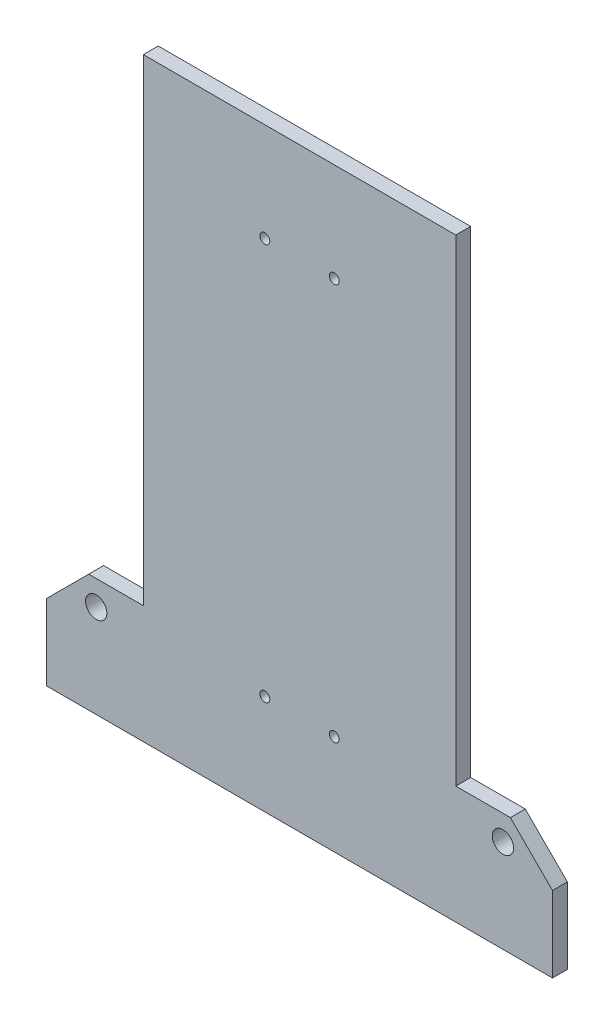
ISO-10303-21;
HEADER;
FILE_DESCRIPTION(('STEP AP214'),'2;1');
FILE_NAME('part.step','',(''),(''),'','','');
FILE_SCHEMA(('AUTOMOTIVE_DESIGN { 1 0 10303 214 1 1 1 1 }'));
ENDSEC;
DATA;
#1=APPLICATION_CONTEXT('core data for automotive mechanical design processes');
#2=APPLICATION_PROTOCOL_DEFINITION('international standard','automotive_design',2000,#1);
#3=PRODUCT_CONTEXT('',#1,'mechanical');
#4=PRODUCT('Part','Part','',(#3));
#5=PRODUCT_RELATED_PRODUCT_CATEGORY('part','',(#4));
#6=PRODUCT_DEFINITION_FORMATION('','',#4);
#7=PRODUCT_DEFINITION_CONTEXT('part definition',#1,'design');
#8=PRODUCT_DEFINITION('design','',#6,#7);
#9=PRODUCT_DEFINITION_SHAPE('','',#8);
#10=(LENGTH_UNIT() NAMED_UNIT(*) SI_UNIT(.MILLI.,.METRE.));
#11=(NAMED_UNIT(*) PLANE_ANGLE_UNIT() SI_UNIT($,.RADIAN.));
#12=(NAMED_UNIT(*) SI_UNIT($,.STERADIAN.) SOLID_ANGLE_UNIT());
#13=UNCERTAINTY_MEASURE_WITH_UNIT(LENGTH_MEASURE(1.E-05),#10,'distance_accuracy_value','');
#14=(GEOMETRIC_REPRESENTATION_CONTEXT(3) GLOBAL_UNCERTAINTY_ASSIGNED_CONTEXT((#13)) GLOBAL_UNIT_ASSIGNED_CONTEXT((#10,
#11,#12)) REPRESENTATION_CONTEXT('',''));
#15=CARTESIAN_POINT('',(0.,0.,0.));
#16=DIRECTION('',(0.,0.,1.));
#17=DIRECTION('',(1.,0.,0.));
#18=AXIS2_PLACEMENT_3D('',#15,#16,#17);
#19=CARTESIAN_POINT('',(-51.0024999998337,41.5460476557996,-3.));
#20=DIRECTION('',(-1.,0.,0.));
#21=DIRECTION('',(0.,0.,1.));
#22=AXIS2_PLACEMENT_3D('',#19,#20,#21);
#23=PLANE('',#22);
#24=DIRECTION('',(0.,0.,1.));
#25=VECTOR('',#24,1.);
#26=CARTESIAN_POINT('',(-51.002499999906,-53.6128200867682,-10.));
#27=LINE('',#26,#25);
#28=CARTESIAN_POINT('',(-51.002499999906,-53.6128200867682,-3.));
#29=VERTEX_POINT('',#28);
#30=CARTESIAN_POINT('',(-51.0024999998337,-53.6128200867682,0.));
#31=VERTEX_POINT('',#30);
#32=EDGE_CURVE('E59',#29,#31,#27,.T.);
#33=ORIENTED_EDGE('',*,*,#32,.F.);
#34=DIRECTION('',(0.,-1.,0.));
#35=VECTOR('',#34,1.);
#36=CARTESIAN_POINT('',(-51.0024999998337,41.5460476557996,-3.));
#37=LINE('',#36,#35);
#38=CARTESIAN_POINT('',(-51.0024999998337,-68.8918828157931,-3.));
#39=VERTEX_POINT('',#38);
#40=EDGE_CURVE('E198',#29,#39,#37,.T.);
#41=ORIENTED_EDGE('',*,*,#40,.T.);
#42=DIRECTION('',(0.,0.,1.));
#43=VECTOR('',#42,1.);
#44=CARTESIAN_POINT('',(-51.0024999998337,-68.8918828157931,-3.));
#45=LINE('',#44,#43);
#46=CARTESIAN_POINT('',(-51.0024999998337,-68.8918828157931,0.));
#47=VERTEX_POINT('',#46);
#48=EDGE_CURVE('E43',#39,#47,#45,.T.);
#49=ORIENTED_EDGE('',*,*,#48,.T.);
#50=DIRECTION('',(0.,-1.,0.));
#51=VECTOR('',#50,1.);
#52=CARTESIAN_POINT('',(-51.0024999998337,41.5460476557996,0.));
#53=LINE('',#52,#51);
#54=EDGE_CURVE('E195',#31,#47,#53,.T.);
#55=ORIENTED_EDGE('',*,*,#54,.F.);
#56=EDGE_LOOP('',(#33,#41,#49,#55));
#57=FACE_BOUND('',#56,.T.);
#58=ADVANCED_FACE('F35',(#57),#23,.T.);
#59=CARTESIAN_POINT('',(40.1096344098316,51.1081171842069,-3.));
#60=DIRECTION('',(0.,1.,0.));
#61=DIRECTION('',(-1.,0.,0.));
#62=AXIS2_PLACEMENT_3D('',#59,#60,#61);
#63=PLANE('',#62);
#64=DIRECTION('',(0.,0.,1.));
#65=VECTOR('',#64,1.);
#66=CARTESIAN_POINT('',(31.4999683606802,51.1081171842069,-3.));
#67=LINE('',#66,#65);
#68=CARTESIAN_POINT('',(31.4999683606802,51.1081171842069,-3.));
#69=VERTEX_POINT('',#68);
#70=CARTESIAN_POINT('',(31.4999683606802,51.1081171842069,0.));
#71=VERTEX_POINT('',#70);
#72=EDGE_CURVE('E51',#69,#71,#67,.T.);
#73=ORIENTED_EDGE('',*,*,#72,.F.);
#74=DIRECTION('',(-1.,0.,0.));
#75=VECTOR('',#74,1.);
#76=CARTESIAN_POINT('',(40.1096344098316,51.1081171842069,-3.));
#77=LINE('',#76,#75);
#78=CARTESIAN_POINT('',(-31.4999670619739,51.1081171842069,-3.));
#79=VERTEX_POINT('',#78);
#80=EDGE_CURVE('E207',#69,#79,#77,.T.);
#81=ORIENTED_EDGE('',*,*,#80,.T.);
#82=DIRECTION('',(0.,0.,-1.));
#83=VECTOR('',#82,1.);
#84=CARTESIAN_POINT('',(-31.4999670619739,51.1081171842069,-3.));
#85=LINE('',#84,#83);
#86=CARTESIAN_POINT('',(-31.4999670619739,51.1081171842069,0.));
#87=VERTEX_POINT('',#86);
#88=EDGE_CURVE('E163',#87,#79,#85,.T.);
#89=ORIENTED_EDGE('',*,*,#88,.F.);
#90=DIRECTION('',(-1.,0.,0.));
#91=VECTOR('',#90,1.);
#92=CARTESIAN_POINT('',(40.1096344098316,51.1081171842069,0.));
#93=LINE('',#92,#91);
#94=EDGE_CURVE('E201',#71,#87,#93,.T.);
#95=ORIENTED_EDGE('',*,*,#94,.F.);
#96=EDGE_LOOP('',(#73,#81,#89,#95));
#97=FACE_BOUND('',#96,.T.);
#98=ADVANCED_FACE('F259',(#97),#63,.T.);
#99=CARTESIAN_POINT('',(51.0025000001551,-68.8918828157931,-3.));
#100=DIRECTION('',(1.,0.,0.));
#101=DIRECTION('',(0.,0.,-1.));
#102=AXIS2_PLACEMENT_3D('',#99,#100,#101);
#103=PLANE('',#102);
#104=DIRECTION('',(0.,0.,1.));
#105=VECTOR('',#104,1.);
#106=CARTESIAN_POINT('',(51.002500000094,-53.6128200867551,-10.));
#107=LINE('',#106,#105);
#108=CARTESIAN_POINT('',(51.002500000094,-53.6128200867551,-3.));
#109=VERTEX_POINT('',#108);
#110=CARTESIAN_POINT('',(51.002500000094,-53.6128200867551,0.));
#111=VERTEX_POINT('',#110);
#112=EDGE_CURVE('E139',#109,#111,#107,.T.);
#113=ORIENTED_EDGE('',*,*,#112,.T.);
#114=DIRECTION('',(0.,1.,0.));
#115=VECTOR('',#114,1.);
#116=CARTESIAN_POINT('',(51.0025000001551,-68.8918828157931,0.));
#117=LINE('',#116,#115);
#118=CARTESIAN_POINT('',(51.0025000001551,-68.8918828157931,0.));
#119=VERTEX_POINT('',#118);
#120=EDGE_CURVE('E214',#119,#111,#117,.T.);
#121=ORIENTED_EDGE('',*,*,#120,.F.);
#122=DIRECTION('',(0.,0.,1.));
#123=VECTOR('',#122,1.);
#124=CARTESIAN_POINT('',(51.0025000001551,-68.8918828157931,-3.));
#125=LINE('',#124,#123);
#126=CARTESIAN_POINT('',(51.0025000001551,-68.8918828157931,-3.));
#127=VERTEX_POINT('',#126);
#128=EDGE_CURVE('E11',#127,#119,#125,.T.);
#129=ORIENTED_EDGE('',*,*,#128,.F.);
#130=DIRECTION('',(0.,1.,0.));
#131=VECTOR('',#130,1.);
#132=CARTESIAN_POINT('',(51.0025000001551,-68.8918828157931,-3.));
#133=LINE('',#132,#131);
#134=EDGE_CURVE('E204',#127,#109,#133,.T.);
#135=ORIENTED_EDGE('',*,*,#134,.T.);
#136=EDGE_LOOP('',(#113,#121,#129,#135));
#137=FACE_BOUND('',#136,.T.);
#138=ADVANCED_FACE('F264',(#137),#103,.T.);
#139=CARTESIAN_POINT('',(-51.0024999998337,-68.8918828157931,-3.));
#140=DIRECTION('',(0.,-1.,0.));
#141=DIRECTION('',(0.,0.,-1.));
#142=AXIS2_PLACEMENT_3D('',#139,#140,#141);
#143=PLANE('',#142);
#144=DIRECTION('',(1.,0.,0.));
#145=VECTOR('',#144,1.);
#146=CARTESIAN_POINT('',(-51.0024999998337,-68.8918828157931,0.));
#147=LINE('',#146,#145);
#148=EDGE_CURVE('E211',#47,#119,#147,.T.);
#149=ORIENTED_EDGE('',*,*,#148,.F.);
#150=ORIENTED_EDGE('',*,*,#48,.F.);
#151=DIRECTION('',(1.,0.,0.));
#152=VECTOR('',#151,1.);
#153=CARTESIAN_POINT('',(-51.0024999998337,-68.8918828157931,-3.));
#154=LINE('',#153,#152);
#155=EDGE_CURVE('E200',#39,#127,#154,.T.);
#156=ORIENTED_EDGE('',*,*,#155,.T.);
#157=ORIENTED_EDGE('',*,*,#128,.T.);
#158=EDGE_LOOP('',(#149,#150,#156,#157));
#159=FACE_BOUND('',#158,.T.);
#160=ADVANCED_FACE('F275',(#159),#143,.T.);
#161=CARTESIAN_POINT('',(0.,0.,-3.));
#162=DIRECTION('',(0.,0.,1.));
#163=DIRECTION('',(1.,0.,0.));
#164=AXIS2_PLACEMENT_3D('',#161,#162,#163);
#165=PLANE('',#164);
#166=CARTESIAN_POINT('',(-6.99983400000011,31.25,-3.));
#167=DIRECTION('',(0.,0.,-1.));
#168=DIRECTION('',(-1.,0.,0.));
#169=AXIS2_PLACEMENT_3D('',#166,#167,#168);
#170=CIRCLE('',#169,0.999999999919336);
#171=CARTESIAN_POINT('',(-7.99983399991945,31.25,-3.));
#172=VERTEX_POINT('',#171);
#173=EDGE_CURVE('E176',#172,#172,#170,.T.);
#174=ORIENTED_EDGE('',*,*,#173,.F.);
#175=EDGE_LOOP('',(#174));
#176=FACE_BOUND('',#175,.T.);
#177=CARTESIAN_POINT('',(7.00016599999989,-48.75,-3.));
#178=DIRECTION('',(0.,0.,-1.));
#179=DIRECTION('',(-1.,0.,0.));
#180=AXIS2_PLACEMENT_3D('',#177,#178,#179);
#181=CIRCLE('',#180,0.999999999926114);
#182=CARTESIAN_POINT('',(6.00016600007378,-48.75,-3.));
#183=VERTEX_POINT('',#182);
#184=EDGE_CURVE('E175',#183,#183,#181,.T.);
#185=ORIENTED_EDGE('',*,*,#184,.F.);
#186=EDGE_LOOP('',(#185));
#187=FACE_BOUND('',#186,.T.);
#188=CARTESIAN_POINT('',(-6.99983400000011,-48.75,-3.));
#189=DIRECTION('',(0.,0.,-1.));
#190=DIRECTION('',(-1.,0.,0.));
#191=AXIS2_PLACEMENT_3D('',#188,#189,#190);
#192=CIRCLE('',#191,0.999999999926497);
#193=CARTESIAN_POINT('',(-7.9998339999266,-48.75,-3.));
#194=VERTEX_POINT('',#193);
#195=EDGE_CURVE('E172',#194,#194,#192,.T.);
#196=ORIENTED_EDGE('',*,*,#195,.F.);
#197=EDGE_LOOP('',(#196));
#198=FACE_BOUND('',#197,.T.);
#199=CARTESIAN_POINT('',(7.00016599999989,31.25,-3.));
#200=DIRECTION('',(0.,0.,-1.));
#201=DIRECTION('',(-1.,0.,0.));
#202=AXIS2_PLACEMENT_3D('',#199,#200,#201);
#203=CIRCLE('',#202,0.999999999918957);
#204=CARTESIAN_POINT('',(6.00016600008093,31.25,-3.));
#205=VERTEX_POINT('',#204);
#206=EDGE_CURVE('E179',#205,#205,#203,.T.);
#207=ORIENTED_EDGE('',*,*,#206,.F.);
#208=EDGE_LOOP('',(#207));
#209=FACE_BOUND('',#208,.T.);
#210=CARTESIAN_POINT('',(-41.0024999998454,-50.1275387124924,-3.));
#211=DIRECTION('',(0.,0.,1.));
#212=DIRECTION('',(1.,0.,0.));
#213=AXIS2_PLACEMENT_3D('',#210,#211,#212);
#214=CIRCLE('',#213,2.14999999982672);
#215=CARTESIAN_POINT('',(-38.8525000000187,-50.1275387124924,-3.));
#216=VERTEX_POINT('',#215);
#217=EDGE_CURVE('E192',#216,#216,#214,.T.);
#218=ORIENTED_EDGE('',*,*,#217,.T.);
#219=EDGE_LOOP('',(#218));
#220=FACE_BOUND('',#219,.T.);
#221=CARTESIAN_POINT('',(41.0025000001546,-50.1275387124819,-3.));
#222=DIRECTION('',(0.,0.,1.));
#223=DIRECTION('',(1.,0.,0.));
#224=AXIS2_PLACEMENT_3D('',#221,#222,#223);
#225=CIRCLE('',#224,2.14999999982705);
#226=CARTESIAN_POINT('',(43.1524999999816,-50.1275387124819,-3.));
#227=VERTEX_POINT('',#226);
#228=EDGE_CURVE('E185',#227,#227,#225,.T.);
#229=ORIENTED_EDGE('',*,*,#228,.T.);
#230=EDGE_LOOP('',(#229));
#231=FACE_BOUND('',#230,.T.);
#232=DIRECTION('',(1.,0.,0.));
#233=VECTOR('',#232,1.);
#234=CARTESIAN_POINT('',(0.,-45.1275387125177,-3.));
#235=LINE('',#234,#233);
#236=CARTESIAN_POINT('',(31.4999964812711,-45.1275387125177,-3.));
#237=VERTEX_POINT('',#236);
#238=CARTESIAN_POINT('',(42.5172186258543,-45.1275387125177,-3.));
#239=VERTEX_POINT('',#238);
#240=EDGE_CURVE('E121',#237,#239,#235,.T.);
#241=ORIENTED_EDGE('',*,*,#240,.T.);
#242=DIRECTION('',(0.70710678118664,-0.707106781186455,0.));
#243=VECTOR('',#242,1.);
#244=CARTESIAN_POINT('',(-1.30516004333727,-1.30516004333761,-3.));
#245=LINE('',#244,#243);
#246=EDGE_CURVE('E169',#239,#109,#245,.T.);
#247=ORIENTED_EDGE('',*,*,#246,.T.);
#248=ORIENTED_EDGE('',*,*,#134,.F.);
#249=ORIENTED_EDGE('',*,*,#155,.F.);
#250=ORIENTED_EDGE('',*,*,#40,.F.);
#251=DIRECTION('',(0.707106781186459,0.707106781186636,0.));
#252=VECTOR('',#251,1.);
#253=CARTESIAN_POINT('',(1.3051600434247,-1.30516004342437,-3.));
#254=LINE('',#253,#252);
#255=CARTESIAN_POINT('',(-42.5172186256685,-45.1275387125286,-3.));
#256=VERTEX_POINT('',#255);
#257=EDGE_CURVE('E142',#29,#256,#254,.T.);
#258=ORIENTED_EDGE('',*,*,#257,.T.);
#259=DIRECTION('',(1.,0.,0.));
#260=VECTOR('',#259,1.);
#261=CARTESIAN_POINT('',(0.,-45.1275387125286,-3.));
#262=LINE('',#261,#260);
#263=CARTESIAN_POINT('',(-31.499999355967,-45.1275387125286,-3.));
#264=VERTEX_POINT('',#263);
#265=EDGE_CURVE('E157',#256,#264,#262,.T.);
#266=ORIENTED_EDGE('',*,*,#265,.T.);
#267=DIRECTION('',(3.35572017078833E-07,0.999999999999944,0.));
#268=VECTOR('',#267,1.);
#269=CARTESIAN_POINT('',(-31.4999842124243,1.05705132401152E-05,-3.));
#270=LINE('',#269,#268);
#271=EDGE_CURVE('E160',#264,#79,#270,.T.);
#272=ORIENTED_EDGE('',*,*,#271,.T.);
#273=ORIENTED_EDGE('',*,*,#80,.F.);
#274=DIRECTION('',(2.9220553042759E-07,-0.999999999999957,0.));
#275=VECTOR('',#274,1.);
#276=CARTESIAN_POINT('',(31.499983294752,9.20446932710362E-06,-3.));
#277=LINE('',#276,#275);
#278=EDGE_CURVE('E165',#69,#237,#277,.T.);
#279=ORIENTED_EDGE('',*,*,#278,.T.);
#280=EDGE_LOOP('',(#241,#247,#248,#249,#250,#258,#266,#272,#273,#279));
#281=FACE_BOUND('',#280,.T.);
#282=ADVANCED_FACE('F235',(#176,#187,#198,#209,#220,#231,#281),#165,.F.);
#283=CARTESIAN_POINT('',(0.,0.,0.));
#284=DIRECTION('',(0.,0.,1.));
#285=DIRECTION('',(1.,0.,0.));
#286=AXIS2_PLACEMENT_3D('',#283,#284,#285);
#287=PLANE('',#286);
#288=DIRECTION('',(0.70710678118664,-0.707106781186455,0.));
#289=VECTOR('',#288,1.);
#290=CARTESIAN_POINT('',(51.002500000094,-53.6128200867551,0.));
#291=LINE('',#290,#289);
#292=CARTESIAN_POINT('',(42.5172186258543,-45.1275387125177,0.));
#293=VERTEX_POINT('',#292);
#294=EDGE_CURVE('E124',#293,#111,#291,.T.);
#295=ORIENTED_EDGE('',*,*,#294,.F.);
#296=DIRECTION('',(1.,0.,0.));
#297=VECTOR('',#296,1.);
#298=CARTESIAN_POINT('',(42.5172186258543,-45.1275387125177,0.));
#299=LINE('',#298,#297);
#300=CARTESIAN_POINT('',(31.4999964812711,-45.1275387125177,0.));
#301=VERTEX_POINT('',#300);
#302=EDGE_CURVE('E118',#301,#293,#299,.T.);
#303=ORIENTED_EDGE('',*,*,#302,.F.);
#304=DIRECTION('',(2.9220553042759E-07,-0.999999999999957,0.));
#305=VECTOR('',#304,1.);
#306=CARTESIAN_POINT('',(31.4999647019776,63.6291073381983,0.));
#307=LINE('',#306,#305);
#308=EDGE_CURVE('E126',#71,#301,#307,.T.);
#309=ORIENTED_EDGE('',*,*,#308,.F.);
#310=ORIENTED_EDGE('',*,*,#94,.T.);
#311=DIRECTION('',(3.35572017078833E-07,0.999999999999944,0.));
#312=VECTOR('',#311,1.);
#313=CARTESIAN_POINT('',(-31.4999657706115,54.9563591499105,0.));
#314=LINE('',#313,#312);
#315=CARTESIAN_POINT('',(-31.499999355967,-45.1275387125286,0.));
#316=VERTEX_POINT('',#315);
#317=EDGE_CURVE('E149',#316,#87,#314,.T.);
#318=ORIENTED_EDGE('',*,*,#317,.F.);
#319=DIRECTION('',(1.,0.,0.));
#320=VECTOR('',#319,1.);
#321=CARTESIAN_POINT('',(-31.499999355967,-45.1275387125286,0.));
#322=LINE('',#321,#320);
#323=CARTESIAN_POINT('',(-42.5172186256685,-45.1275387125286,0.));
#324=VERTEX_POINT('',#323);
#325=EDGE_CURVE('E146',#324,#316,#322,.T.);
#326=ORIENTED_EDGE('',*,*,#325,.F.);
#327=DIRECTION('',(0.707106781186459,0.707106781186636,0.));
#328=VECTOR('',#327,1.);
#329=CARTESIAN_POINT('',(-42.5172186256685,-45.1275387125286,0.));
#330=LINE('',#329,#328);
#331=EDGE_CURVE('E144',#31,#324,#330,.T.);
#332=ORIENTED_EDGE('',*,*,#331,.F.);
#333=ORIENTED_EDGE('',*,*,#54,.T.);
#334=ORIENTED_EDGE('',*,*,#148,.T.);
#335=ORIENTED_EDGE('',*,*,#120,.T.);
#336=EDGE_LOOP('',(#295,#303,#309,#310,#318,#326,#332,#333,#334,#335));
#337=FACE_BOUND('',#336,.T.);
#338=CARTESIAN_POINT('',(-6.99983400000011,31.25,0.));
#339=DIRECTION('',(0.,0.,1.));
#340=DIRECTION('',(1.,0.,0.));
#341=AXIS2_PLACEMENT_3D('',#338,#339,#340);
#342=CIRCLE('',#341,0.999999999919336);
#343=CARTESIAN_POINT('',(-5.99983400008078,31.25,0.));
#344=VERTEX_POINT('',#343);
#345=EDGE_CURVE('E38',#344,#344,#342,.T.);
#346=ORIENTED_EDGE('',*,*,#345,.F.);
#347=EDGE_LOOP('',(#346));
#348=FACE_BOUND('',#347,.T.);
#349=CARTESIAN_POINT('',(7.00016599999989,-48.75,0.));
#350=DIRECTION('',(0.,0.,1.));
#351=DIRECTION('',(1.,0.,0.));
#352=AXIS2_PLACEMENT_3D('',#349,#350,#351);
#353=CIRCLE('',#352,0.999999999926114);
#354=CARTESIAN_POINT('',(8.00016599992601,-48.75,0.));
#355=VERTEX_POINT('',#354);
#356=EDGE_CURVE('E223',#355,#355,#353,.T.);
#357=ORIENTED_EDGE('',*,*,#356,.F.);
#358=EDGE_LOOP('',(#357));
#359=FACE_BOUND('',#358,.T.);
#360=CARTESIAN_POINT('',(-6.99983400000011,-48.75,0.));
#361=DIRECTION('',(0.,0.,1.));
#362=DIRECTION('',(1.,0.,0.));
#363=AXIS2_PLACEMENT_3D('',#360,#361,#362);
#364=CIRCLE('',#363,0.999999999926497);
#365=CARTESIAN_POINT('',(-5.99983400007361,-48.75,0.));
#366=VERTEX_POINT('',#365);
#367=EDGE_CURVE('E221',#366,#366,#364,.T.);
#368=ORIENTED_EDGE('',*,*,#367,.F.);
#369=EDGE_LOOP('',(#368));
#370=FACE_BOUND('',#369,.T.);
#371=CARTESIAN_POINT('',(7.00016599999989,31.25,0.));
#372=DIRECTION('',(0.,0.,1.));
#373=DIRECTION('',(1.,0.,0.));
#374=AXIS2_PLACEMENT_3D('',#371,#372,#373);
#375=CIRCLE('',#374,0.999999999918957);
#376=CARTESIAN_POINT('',(8.00016599991884,31.25,0.));
#377=VERTEX_POINT('',#376);
#378=EDGE_CURVE('E184',#377,#377,#375,.T.);
#379=ORIENTED_EDGE('',*,*,#378,.F.);
#380=EDGE_LOOP('',(#379));
#381=FACE_BOUND('',#380,.T.);
#382=CARTESIAN_POINT('',(-41.0024999998454,-50.1275387124924,0.));
#383=DIRECTION('',(0.,0.,1.));
#384=DIRECTION('',(1.,0.,0.));
#385=AXIS2_PLACEMENT_3D('',#382,#383,#384);
#386=CIRCLE('',#385,2.14999999982672);
#387=CARTESIAN_POINT('',(-38.8525000000187,-50.1275387124924,0.));
#388=VERTEX_POINT('',#387);
#389=EDGE_CURVE('E188',#388,#388,#386,.T.);
#390=ORIENTED_EDGE('',*,*,#389,.F.);
#391=EDGE_LOOP('',(#390));
#392=FACE_BOUND('',#391,.T.);
#393=CARTESIAN_POINT('',(41.0025000001546,-50.1275387124819,0.));
#394=DIRECTION('',(0.,0.,1.));
#395=DIRECTION('',(1.,0.,0.));
#396=AXIS2_PLACEMENT_3D('',#393,#394,#395);
#397=CIRCLE('',#396,2.14999999982705);
#398=CARTESIAN_POINT('',(43.1524999999816,-50.1275387124819,0.));
#399=VERTEX_POINT('',#398);
#400=EDGE_CURVE('E189',#399,#399,#397,.T.);
#401=ORIENTED_EDGE('',*,*,#400,.F.);
#402=EDGE_LOOP('',(#401));
#403=FACE_BOUND('',#402,.T.);
#404=ADVANCED_FACE('F133',(#337,#348,#359,#370,#381,#392,#403),#287,.T.);
#405=CARTESIAN_POINT('',(41.0025000001546,-50.1275387124819,-3.));
#406=DIRECTION('',(0.,0.,1.));
#407=DIRECTION('',(1.,0.,0.));
#408=AXIS2_PLACEMENT_3D('',#405,#406,#407);
#409=CYLINDRICAL_SURFACE('',#408,2.14999999982705);
#410=ORIENTED_EDGE('',*,*,#228,.F.);
#411=EDGE_LOOP('',(#410));
#412=FACE_BOUND('',#411,.T.);
#413=ORIENTED_EDGE('',*,*,#400,.T.);
#414=EDGE_LOOP('',(#413));
#415=FACE_BOUND('',#414,.T.);
#416=ADVANCED_FACE('F234',(#412,#415),#409,.F.);
#417=CARTESIAN_POINT('',(-41.0024999998454,-50.1275387124924,-3.));
#418=DIRECTION('',(0.,0.,1.));
#419=DIRECTION('',(1.,0.,0.));
#420=AXIS2_PLACEMENT_3D('',#417,#418,#419);
#421=CYLINDRICAL_SURFACE('',#420,2.14999999982672);
#422=ORIENTED_EDGE('',*,*,#217,.F.);
#423=EDGE_LOOP('',(#422));
#424=FACE_BOUND('',#423,.T.);
#425=ORIENTED_EDGE('',*,*,#389,.T.);
#426=EDGE_LOOP('',(#425));
#427=FACE_BOUND('',#426,.T.);
#428=ADVANCED_FACE('F247',(#424,#427),#421,.F.);
#429=CARTESIAN_POINT('',(7.00016599999989,31.25,67.));
#430=DIRECTION('',(0.,0.,-1.));
#431=DIRECTION('',(-1.,0.,0.));
#432=AXIS2_PLACEMENT_3D('',#429,#430,#431);
#433=CYLINDRICAL_SURFACE('',#432,0.999999999918957);
#434=ORIENTED_EDGE('',*,*,#378,.T.);
#435=EDGE_LOOP('',(#434));
#436=FACE_BOUND('',#435,.T.);
#437=ORIENTED_EDGE('',*,*,#206,.T.);
#438=EDGE_LOOP('',(#437));
#439=FACE_BOUND('',#438,.T.);
#440=ADVANCED_FACE('F253',(#436,#439),#433,.F.);
#441=CARTESIAN_POINT('',(-6.99983400000011,-48.75,67.));
#442=DIRECTION('',(0.,0.,-1.));
#443=DIRECTION('',(-1.,0.,0.));
#444=AXIS2_PLACEMENT_3D('',#441,#442,#443);
#445=CYLINDRICAL_SURFACE('',#444,0.999999999926497);
#446=ORIENTED_EDGE('',*,*,#367,.T.);
#447=EDGE_LOOP('',(#446));
#448=FACE_BOUND('',#447,.T.);
#449=ORIENTED_EDGE('',*,*,#195,.T.);
#450=EDGE_LOOP('',(#449));
#451=FACE_BOUND('',#450,.T.);
#452=ADVANCED_FACE('F303',(#448,#451),#445,.F.);
#453=CARTESIAN_POINT('',(7.00016599999989,-48.75,67.));
#454=DIRECTION('',(0.,0.,-1.));
#455=DIRECTION('',(-1.,0.,0.));
#456=AXIS2_PLACEMENT_3D('',#453,#454,#455);
#457=CYLINDRICAL_SURFACE('',#456,0.999999999926114);
#458=ORIENTED_EDGE('',*,*,#356,.T.);
#459=EDGE_LOOP('',(#458));
#460=FACE_BOUND('',#459,.T.);
#461=ORIENTED_EDGE('',*,*,#184,.T.);
#462=EDGE_LOOP('',(#461));
#463=FACE_BOUND('',#462,.T.);
#464=ADVANCED_FACE('F306',(#460,#463),#457,.F.);
#465=CARTESIAN_POINT('',(-6.99983400000011,31.25,67.));
#466=DIRECTION('',(0.,0.,-1.));
#467=DIRECTION('',(-1.,0.,0.));
#468=AXIS2_PLACEMENT_3D('',#465,#466,#467);
#469=CYLINDRICAL_SURFACE('',#468,0.999999999919336);
#470=ORIENTED_EDGE('',*,*,#345,.T.);
#471=EDGE_LOOP('',(#470));
#472=FACE_BOUND('',#471,.T.);
#473=ORIENTED_EDGE('',*,*,#173,.T.);
#474=EDGE_LOOP('',(#473));
#475=FACE_BOUND('',#474,.T.);
#476=ADVANCED_FACE('F230',(#472,#475),#469,.F.);
#477=CARTESIAN_POINT('',(-31.499999355967,-45.1275387125286,-10.));
#478=DIRECTION('',(0.,-1.,0.));
#479=DIRECTION('',(0.,0.,-1.));
#480=AXIS2_PLACEMENT_3D('',#477,#478,#479);
#481=PLANE('',#480);
#482=DIRECTION('',(0.,0.,1.));
#483=VECTOR('',#482,1.);
#484=CARTESIAN_POINT('',(-42.5172186256685,-45.1275387125286,-10.));
#485=LINE('',#484,#483);
#486=EDGE_CURVE('E152',#256,#324,#485,.T.);
#487=ORIENTED_EDGE('',*,*,#486,.T.);
#488=ORIENTED_EDGE('',*,*,#325,.T.);
#489=DIRECTION('',(0.,0.,1.));
#490=VECTOR('',#489,1.);
#491=CARTESIAN_POINT('',(-31.499999355967,-45.1275387125286,-10.));
#492=LINE('',#491,#490);
#493=EDGE_CURVE('E131',#264,#316,#492,.T.);
#494=ORIENTED_EDGE('',*,*,#493,.F.);
#495=ORIENTED_EDGE('',*,*,#265,.F.);
#496=EDGE_LOOP('',(#487,#488,#494,#495));
#497=FACE_BOUND('',#496,.T.);
#498=ADVANCED_FACE('F282',(#497),#481,.F.);
#499=CARTESIAN_POINT('',(-42.5172186256685,-45.1275387125286,-10.));
#500=DIRECTION('',(0.707106781186636,-0.707106781186459,0.));
#501=DIRECTION('',(0.707106781186459,0.707106781186636,0.));
#502=AXIS2_PLACEMENT_3D('',#499,#500,#501);
#503=PLANE('',#502);
#504=ORIENTED_EDGE('',*,*,#32,.T.);
#505=ORIENTED_EDGE('',*,*,#331,.T.);
#506=ORIENTED_EDGE('',*,*,#486,.F.);
#507=ORIENTED_EDGE('',*,*,#257,.F.);
#508=EDGE_LOOP('',(#504,#505,#506,#507));
#509=FACE_BOUND('',#508,.T.);
#510=ADVANCED_FACE('F280',(#509),#503,.F.);
#511=CARTESIAN_POINT('',(-31.4999657706115,54.9563591499105,-10.));
#512=DIRECTION('',(0.999999999999944,-3.35572017078833E-07,0.));
#513=DIRECTION('',(3.35572017078833E-07,0.999999999999944,0.));
#514=AXIS2_PLACEMENT_3D('',#511,#512,#513);
#515=PLANE('',#514);
#516=ORIENTED_EDGE('',*,*,#88,.T.);
#517=ORIENTED_EDGE('',*,*,#271,.F.);
#518=ORIENTED_EDGE('',*,*,#493,.T.);
#519=ORIENTED_EDGE('',*,*,#317,.T.);
#520=EDGE_LOOP('',(#516,#517,#518,#519));
#521=FACE_BOUND('',#520,.T.);
#522=ADVANCED_FACE('F287',(#521),#515,.F.);
#523=CARTESIAN_POINT('',(51.002500000094,-53.6128200867551,-10.));
#524=DIRECTION('',(-0.707106781186455,-0.70710678118664,0.));
#525=DIRECTION('',(0.70710678118664,-0.707106781186455,0.));
#526=AXIS2_PLACEMENT_3D('',#523,#524,#525);
#527=PLANE('',#526);
#528=DIRECTION('',(0.,0.,1.));
#529=VECTOR('',#528,1.);
#530=CARTESIAN_POINT('',(42.5172186258543,-45.1275387125177,-10.));
#531=LINE('',#530,#529);
#532=EDGE_CURVE('E123',#239,#293,#531,.T.);
#533=ORIENTED_EDGE('',*,*,#532,.T.);
#534=ORIENTED_EDGE('',*,*,#294,.T.);
#535=ORIENTED_EDGE('',*,*,#112,.F.);
#536=ORIENTED_EDGE('',*,*,#246,.F.);
#537=EDGE_LOOP('',(#533,#534,#535,#536));
#538=FACE_BOUND('',#537,.T.);
#539=ADVANCED_FACE('F289',(#538),#527,.F.);
#540=CARTESIAN_POINT('',(42.5172186258543,-45.1275387125177,-10.));
#541=DIRECTION('',(0.,-1.,0.));
#542=DIRECTION('',(0.,0.,-1.));
#543=AXIS2_PLACEMENT_3D('',#540,#541,#542);
#544=PLANE('',#543);
#545=DIRECTION('',(0.,0.,1.));
#546=VECTOR('',#545,1.);
#547=CARTESIAN_POINT('',(31.4999964812711,-45.1275387125177,-10.));
#548=LINE('',#547,#546);
#549=EDGE_CURVE('E114',#237,#301,#548,.T.);
#550=ORIENTED_EDGE('',*,*,#549,.T.);
#551=ORIENTED_EDGE('',*,*,#302,.T.);
#552=ORIENTED_EDGE('',*,*,#532,.F.);
#553=ORIENTED_EDGE('',*,*,#240,.F.);
#554=EDGE_LOOP('',(#550,#551,#552,#553));
#555=FACE_BOUND('',#554,.T.);
#556=ADVANCED_FACE('F115',(#555),#544,.F.);
#557=CARTESIAN_POINT('',(31.4999647019776,63.6291073381983,-10.));
#558=DIRECTION('',(-0.999999999999957,-2.9220553042759E-07,0.));
#559=DIRECTION('',(2.9220553042759E-07,-0.999999999999957,0.));
#560=AXIS2_PLACEMENT_3D('',#557,#558,#559);
#561=PLANE('',#560);
#562=ORIENTED_EDGE('',*,*,#72,.T.);
#563=ORIENTED_EDGE('',*,*,#308,.T.);
#564=ORIENTED_EDGE('',*,*,#549,.F.);
#565=ORIENTED_EDGE('',*,*,#278,.F.);
#566=EDGE_LOOP('',(#562,#563,#564,#565));
#567=FACE_BOUND('',#566,.T.);
#568=ADVANCED_FACE('F127',(#567),#561,.F.);
#569=CLOSED_SHELL('',(#58,#98,#138,#160,#282,#404,#416,#428,#440,#452,#464,#476,#498,#510,#522,
#539,#556,#568));
#570=MANIFOLD_SOLID_BREP('B2',#569);
#571=ADVANCED_BREP_SHAPE_REPRESENTATION('',(#18,#570),#14);
#572=SHAPE_DEFINITION_REPRESENTATION(#9,#571);
ENDSEC;
END-ISO-10303-21;
